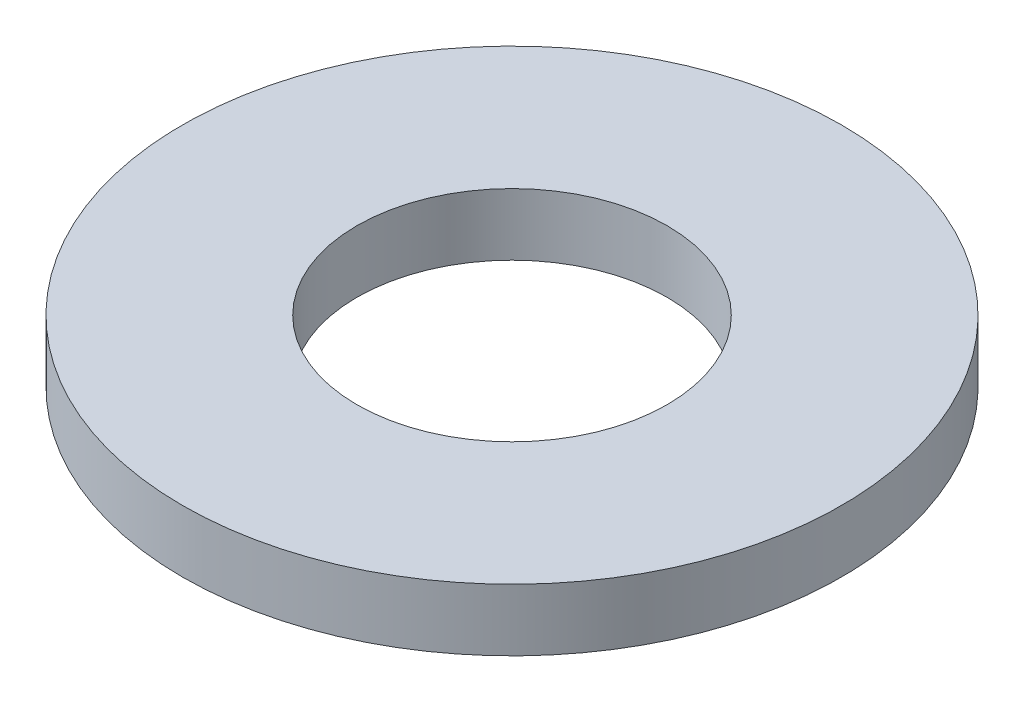
ISO-10303-21;
HEADER;
FILE_DESCRIPTION(('STEP AP214'),'2;1');
FILE_NAME('part.step','',(''),(''),'','','');
FILE_SCHEMA(('AUTOMOTIVE_DESIGN { 1 0 10303 214 1 1 1 1 }'));
ENDSEC;
DATA;
#1=APPLICATION_CONTEXT('core data for automotive mechanical design processes');
#2=APPLICATION_PROTOCOL_DEFINITION('international standard','automotive_design',2000,#1);
#3=PRODUCT_CONTEXT('',#1,'mechanical');
#4=PRODUCT('Part','Part','',(#3));
#5=PRODUCT_RELATED_PRODUCT_CATEGORY('part','',(#4));
#6=PRODUCT_DEFINITION_FORMATION('','',#4);
#7=PRODUCT_DEFINITION_CONTEXT('part definition',#1,'design');
#8=PRODUCT_DEFINITION('design','',#6,#7);
#9=PRODUCT_DEFINITION_SHAPE('','',#8);
#10=(LENGTH_UNIT() NAMED_UNIT(*) SI_UNIT(.MILLI.,.METRE.));
#11=(NAMED_UNIT(*) PLANE_ANGLE_UNIT() SI_UNIT($,.RADIAN.));
#12=(NAMED_UNIT(*) SI_UNIT($,.STERADIAN.) SOLID_ANGLE_UNIT());
#13=UNCERTAINTY_MEASURE_WITH_UNIT(LENGTH_MEASURE(1.E-05),#10,'distance_accuracy_value','');
#14=(GEOMETRIC_REPRESENTATION_CONTEXT(3) GLOBAL_UNCERTAINTY_ASSIGNED_CONTEXT((#13)) GLOBAL_UNIT_ASSIGNED_CONTEXT((#10,
#11,#12)) REPRESENTATION_CONTEXT('',''));
#15=CARTESIAN_POINT('',(0.,0.,0.));
#16=DIRECTION('',(0.,0.,1.));
#17=DIRECTION('',(1.,0.,0.));
#18=AXIS2_PLACEMENT_3D('',#15,#16,#17);
#19=CARTESIAN_POINT('',(0.,0.64,0.));
#20=DIRECTION('',(0.,1.,0.));
#21=DIRECTION('',(0.,0.,1.));
#22=AXIS2_PLACEMENT_3D('',#19,#20,#21);
#23=PLANE('',#22);
#24=CARTESIAN_POINT('',(0.,0.64,0.));
#25=DIRECTION('',(0.,1.,0.));
#26=DIRECTION('',(0.,0.,1.));
#27=AXIS2_PLACEMENT_3D('',#24,#25,#26);
#28=CIRCLE('',#27,3.4);
#29=CARTESIAN_POINT('',(0.,0.64,-3.4));
#30=VERTEX_POINT('',#29);
#31=EDGE_CURVE('E10',#30,#30,#28,.T.);
#32=ORIENTED_EDGE('',*,*,#31,.T.);
#33=EDGE_LOOP('',(#32));
#34=FACE_BOUND('',#33,.T.);
#35=CARTESIAN_POINT('',(0.,0.64,0.));
#36=DIRECTION('',(0.,1.,0.));
#37=DIRECTION('',(0.,0.,1.));
#38=AXIS2_PLACEMENT_3D('',#35,#36,#37);
#39=CIRCLE('',#38,1.6);
#40=CARTESIAN_POINT('',(0.,0.64,-1.6));
#41=VERTEX_POINT('',#40);
#42=EDGE_CURVE('E54',#41,#41,#39,.T.);
#43=ORIENTED_EDGE('',*,*,#42,.F.);
#44=EDGE_LOOP('',(#43));
#45=FACE_BOUND('',#44,.T.);
#46=ADVANCED_FACE('F41',(#34,#45),#23,.T.);
#47=CARTESIAN_POINT('',(0.,0.,0.));
#48=DIRECTION('',(0.,1.,0.));
#49=DIRECTION('',(0.,0.,1.));
#50=AXIS2_PLACEMENT_3D('',#47,#48,#49);
#51=PLANE('',#50);
#52=CARTESIAN_POINT('',(0.,0.,0.));
#53=DIRECTION('',(0.,1.,0.));
#54=DIRECTION('',(0.,0.,1.));
#55=AXIS2_PLACEMENT_3D('',#52,#53,#54);
#56=CIRCLE('',#55,3.4);
#57=CARTESIAN_POINT('',(0.,0.,-3.4));
#58=VERTEX_POINT('',#57);
#59=EDGE_CURVE('E45',#58,#58,#56,.T.);
#60=ORIENTED_EDGE('',*,*,#59,.F.);
#61=EDGE_LOOP('',(#60));
#62=FACE_BOUND('',#61,.T.);
#63=CARTESIAN_POINT('',(0.,0.,0.));
#64=DIRECTION('',(0.,1.,0.));
#65=DIRECTION('',(0.,0.,1.));
#66=AXIS2_PLACEMENT_3D('',#63,#64,#65);
#67=CIRCLE('',#66,1.6);
#68=CARTESIAN_POINT('',(0.,0.,-1.6));
#69=VERTEX_POINT('',#68);
#70=EDGE_CURVE('E56',#69,#69,#67,.T.);
#71=ORIENTED_EDGE('',*,*,#70,.T.);
#72=EDGE_LOOP('',(#71));
#73=FACE_BOUND('',#72,.T.);
#74=ADVANCED_FACE('F68',(#62,#73),#51,.F.);
#75=CARTESIAN_POINT('',(0.,0.64,0.));
#76=DIRECTION('',(0.,-1.,0.));
#77=DIRECTION('',(0.,0.,-1.));
#78=AXIS2_PLACEMENT_3D('',#75,#76,#77);
#79=CYLINDRICAL_SURFACE('',#78,3.4);
#80=CARTESIAN_POINT('',(0.,0.64,-3.4));
#81=CARTESIAN_POINT('',(0.,0.633333333333333,-3.4));
#82=CARTESIAN_POINT('',(0.,0.626666666666667,-3.4));
#83=CARTESIAN_POINT('',(0.,0.613333333333333,-3.4));
#84=CARTESIAN_POINT('',(0.,0.606666666666667,-3.4));
#85=CARTESIAN_POINT('',(0.,0.593333333333333,-3.4));
#86=CARTESIAN_POINT('',(0.,0.586666666666667,-3.4));
#87=CARTESIAN_POINT('',(0.,0.573333333333333,-3.4));
#88=CARTESIAN_POINT('',(0.,0.566666666666667,-3.4));
#89=CARTESIAN_POINT('',(0.,0.553333333333333,-3.4));
#90=CARTESIAN_POINT('',(0.,0.546666666666667,-3.4));
#91=CARTESIAN_POINT('',(0.,0.533333333333333,-3.4));
#92=CARTESIAN_POINT('',(0.,0.526666666666667,-3.4));
#93=CARTESIAN_POINT('',(0.,0.513333333333333,-3.4));
#94=CARTESIAN_POINT('',(0.,0.506666666666667,-3.4));
#95=CARTESIAN_POINT('',(0.,0.493333333333333,-3.4));
#96=CARTESIAN_POINT('',(0.,0.486666666666667,-3.4));
#97=CARTESIAN_POINT('',(0.,0.473333333333333,-3.4));
#98=CARTESIAN_POINT('',(0.,0.466666666666667,-3.4));
#99=CARTESIAN_POINT('',(0.,0.453333333333333,-3.4));
#100=CARTESIAN_POINT('',(0.,0.446666666666667,-3.4));
#101=CARTESIAN_POINT('',(0.,0.433333333333333,-3.4));
#102=CARTESIAN_POINT('',(0.,0.426666666666667,-3.4));
#103=CARTESIAN_POINT('',(0.,0.413333333333333,-3.4));
#104=CARTESIAN_POINT('',(0.,0.406666666666667,-3.4));
#105=CARTESIAN_POINT('',(0.,0.393333333333333,-3.4));
#106=CARTESIAN_POINT('',(0.,0.386666666666667,-3.4));
#107=CARTESIAN_POINT('',(0.,0.373333333333333,-3.4));
#108=CARTESIAN_POINT('',(0.,0.366666666666667,-3.4));
#109=CARTESIAN_POINT('',(0.,0.353333333333333,-3.4));
#110=CARTESIAN_POINT('',(0.,0.346666666666667,-3.4));
#111=CARTESIAN_POINT('',(0.,0.333333333333333,-3.4));
#112=CARTESIAN_POINT('',(0.,0.326666666666667,-3.4));
#113=CARTESIAN_POINT('',(0.,0.313333333333333,-3.4));
#114=CARTESIAN_POINT('',(0.,0.306666666666667,-3.4));
#115=CARTESIAN_POINT('',(0.,0.293333333333333,-3.4));
#116=CARTESIAN_POINT('',(0.,0.286666666666667,-3.4));
#117=CARTESIAN_POINT('',(0.,0.273333333333333,-3.4));
#118=CARTESIAN_POINT('',(0.,0.266666666666667,-3.4));
#119=CARTESIAN_POINT('',(0.,0.253333333333333,-3.4));
#120=CARTESIAN_POINT('',(0.,0.246666666666667,-3.4));
#121=CARTESIAN_POINT('',(0.,0.233333333333333,-3.4));
#122=CARTESIAN_POINT('',(0.,0.226666666666667,-3.4));
#123=CARTESIAN_POINT('',(0.,0.213333333333333,-3.4));
#124=CARTESIAN_POINT('',(0.,0.206666666666667,-3.4));
#125=CARTESIAN_POINT('',(0.,0.193333333333333,-3.4));
#126=CARTESIAN_POINT('',(0.,0.186666666666667,-3.4));
#127=CARTESIAN_POINT('',(0.,0.173333333333333,-3.4));
#128=CARTESIAN_POINT('',(0.,0.166666666666667,-3.4));
#129=CARTESIAN_POINT('',(0.,0.153333333333333,-3.4));
#130=CARTESIAN_POINT('',(0.,0.146666666666667,-3.4));
#131=CARTESIAN_POINT('',(0.,0.133333333333333,-3.4));
#132=CARTESIAN_POINT('',(0.,0.126666666666667,-3.4));
#133=CARTESIAN_POINT('',(0.,0.113333333333333,-3.4));
#134=CARTESIAN_POINT('',(0.,0.106666666666667,-3.4));
#135=CARTESIAN_POINT('',(0.,0.0933333333333334,-3.4));
#136=CARTESIAN_POINT('',(0.,0.0866666666666667,-3.4));
#137=CARTESIAN_POINT('',(0.,0.0733333333333333,-3.4));
#138=CARTESIAN_POINT('',(0.,0.0666666666666667,-3.4));
#139=CARTESIAN_POINT('',(0.,0.0533333333333334,-3.4));
#140=CARTESIAN_POINT('',(0.,0.0466666666666667,-3.4));
#141=CARTESIAN_POINT('',(0.,0.0333333333333333,-3.4));
#142=CARTESIAN_POINT('',(0.,0.0266666666666667,-3.4));
#143=CARTESIAN_POINT('',(0.,0.0133333333333334,-3.4));
#144=CARTESIAN_POINT('',(0.,0.00666666666666668,-3.4));
#145=CARTESIAN_POINT('',(0.,0.,-3.4));
#146=B_SPLINE_CURVE_WITH_KNOTS('',3,(#80,#81,#82,#83,#84,#85,#86,#87,#88,#89,#90,#91,#92,#93,
#94,#95,#96,#97,#98,#99,#100,#101,#102,#103,#104,#105,#106,#107,#108,#109,#110,#111,#112,#113,
#114,#115,#116,#117,#118,#119,#120,#121,#122,#123,#124,#125,#126,#127,#128,#129,#130,#131,#132,
#133,#134,#135,#136,#137,#138,#139,#140,#141,#142,#143,#144,#145),.UNSPECIFIED.,.F.,.F.,(4,2,2,
2,2,2,2,2,2,2,2,2,2,2,2,2,2,2,2,2,2,2,2,2,2,2,2,2,2,2,2,2,4),(0.,0.0200000000000001,
0.0400000000000001,0.06,0.0800000000000001,0.1,0.12,0.14,0.16,0.18,0.2,0.22,0.24,0.26,0.28,0.3,
0.32,0.34,0.36,0.38,0.4,0.42,0.44,0.46,0.48,0.5,0.52,0.54,0.56,0.58,0.6,0.62,0.64),.UNSPECIFIED.);
#147=EDGE_CURVE('BSEAM43',#30,#58,#146,.T.);
#148=ORIENTED_EDGE('',*,*,#31,.F.);
#149=ORIENTED_EDGE('',*,*,#59,.T.);
#150=ORIENTED_EDGE('',*,*,#147,.T.);
#151=ORIENTED_EDGE('',*,*,#147,.F.);
#152=EDGE_LOOP('',(#148,#150,#149,#151));
#153=FACE_BOUND('',#152,.T.);
#154=ADVANCED_FACE('F43',(#153),#79,.T.);
#155=CARTESIAN_POINT('',(0.,0.64,0.));
#156=DIRECTION('',(0.,-1.,0.));
#157=DIRECTION('',(0.,0.,-1.));
#158=AXIS2_PLACEMENT_3D('',#155,#156,#157);
#159=CYLINDRICAL_SURFACE('',#158,1.6);
#160=CARTESIAN_POINT('',(0.,0.64,-1.6));
#161=CARTESIAN_POINT('',(0.,0.633333333333333,-1.6));
#162=CARTESIAN_POINT('',(0.,0.626666666666667,-1.6));
#163=CARTESIAN_POINT('',(0.,0.613333333333333,-1.6));
#164=CARTESIAN_POINT('',(0.,0.606666666666667,-1.6));
#165=CARTESIAN_POINT('',(0.,0.593333333333333,-1.6));
#166=CARTESIAN_POINT('',(0.,0.586666666666667,-1.6));
#167=CARTESIAN_POINT('',(0.,0.573333333333333,-1.6));
#168=CARTESIAN_POINT('',(0.,0.566666666666667,-1.6));
#169=CARTESIAN_POINT('',(0.,0.553333333333333,-1.6));
#170=CARTESIAN_POINT('',(0.,0.546666666666667,-1.6));
#171=CARTESIAN_POINT('',(0.,0.533333333333333,-1.6));
#172=CARTESIAN_POINT('',(0.,0.526666666666667,-1.6));
#173=CARTESIAN_POINT('',(0.,0.513333333333333,-1.6));
#174=CARTESIAN_POINT('',(0.,0.506666666666667,-1.6));
#175=CARTESIAN_POINT('',(0.,0.493333333333333,-1.6));
#176=CARTESIAN_POINT('',(0.,0.486666666666667,-1.6));
#177=CARTESIAN_POINT('',(0.,0.473333333333333,-1.6));
#178=CARTESIAN_POINT('',(0.,0.466666666666667,-1.6));
#179=CARTESIAN_POINT('',(0.,0.453333333333333,-1.6));
#180=CARTESIAN_POINT('',(0.,0.446666666666667,-1.6));
#181=CARTESIAN_POINT('',(0.,0.433333333333333,-1.6));
#182=CARTESIAN_POINT('',(0.,0.426666666666667,-1.6));
#183=CARTESIAN_POINT('',(0.,0.413333333333333,-1.6));
#184=CARTESIAN_POINT('',(0.,0.406666666666667,-1.6));
#185=CARTESIAN_POINT('',(0.,0.393333333333333,-1.6));
#186=CARTESIAN_POINT('',(0.,0.386666666666667,-1.6));
#187=CARTESIAN_POINT('',(0.,0.373333333333333,-1.6));
#188=CARTESIAN_POINT('',(0.,0.366666666666667,-1.6));
#189=CARTESIAN_POINT('',(0.,0.353333333333333,-1.6));
#190=CARTESIAN_POINT('',(0.,0.346666666666667,-1.6));
#191=CARTESIAN_POINT('',(0.,0.333333333333333,-1.6));
#192=CARTESIAN_POINT('',(0.,0.326666666666667,-1.6));
#193=CARTESIAN_POINT('',(0.,0.313333333333333,-1.6));
#194=CARTESIAN_POINT('',(0.,0.306666666666667,-1.6));
#195=CARTESIAN_POINT('',(0.,0.293333333333333,-1.6));
#196=CARTESIAN_POINT('',(0.,0.286666666666667,-1.6));
#197=CARTESIAN_POINT('',(0.,0.273333333333333,-1.6));
#198=CARTESIAN_POINT('',(0.,0.266666666666667,-1.6));
#199=CARTESIAN_POINT('',(0.,0.253333333333333,-1.6));
#200=CARTESIAN_POINT('',(0.,0.246666666666667,-1.6));
#201=CARTESIAN_POINT('',(0.,0.233333333333333,-1.6));
#202=CARTESIAN_POINT('',(0.,0.226666666666667,-1.6));
#203=CARTESIAN_POINT('',(0.,0.213333333333333,-1.6));
#204=CARTESIAN_POINT('',(0.,0.206666666666667,-1.6));
#205=CARTESIAN_POINT('',(0.,0.193333333333333,-1.6));
#206=CARTESIAN_POINT('',(0.,0.186666666666667,-1.6));
#207=CARTESIAN_POINT('',(0.,0.173333333333333,-1.6));
#208=CARTESIAN_POINT('',(0.,0.166666666666667,-1.6));
#209=CARTESIAN_POINT('',(0.,0.153333333333333,-1.6));
#210=CARTESIAN_POINT('',(0.,0.146666666666667,-1.6));
#211=CARTESIAN_POINT('',(0.,0.133333333333333,-1.6));
#212=CARTESIAN_POINT('',(0.,0.126666666666667,-1.6));
#213=CARTESIAN_POINT('',(0.,0.113333333333333,-1.6));
#214=CARTESIAN_POINT('',(0.,0.106666666666667,-1.6));
#215=CARTESIAN_POINT('',(0.,0.0933333333333334,-1.6));
#216=CARTESIAN_POINT('',(0.,0.0866666666666667,-1.6));
#217=CARTESIAN_POINT('',(0.,0.0733333333333333,-1.6));
#218=CARTESIAN_POINT('',(0.,0.0666666666666667,-1.6));
#219=CARTESIAN_POINT('',(0.,0.0533333333333334,-1.6));
#220=CARTESIAN_POINT('',(0.,0.0466666666666667,-1.6));
#221=CARTESIAN_POINT('',(0.,0.0333333333333333,-1.6));
#222=CARTESIAN_POINT('',(0.,0.0266666666666667,-1.6));
#223=CARTESIAN_POINT('',(0.,0.0133333333333334,-1.6));
#224=CARTESIAN_POINT('',(0.,0.00666666666666668,-1.6));
#225=CARTESIAN_POINT('',(0.,0.,-1.6));
#226=B_SPLINE_CURVE_WITH_KNOTS('',3,(#160,#161,#162,#163,#164,#165,#166,#167,#168,#169,#170,
#171,#172,#173,#174,#175,#176,#177,#178,#179,#180,#181,#182,#183,#184,#185,#186,#187,#188,#189,
#190,#191,#192,#193,#194,#195,#196,#197,#198,#199,#200,#201,#202,#203,#204,#205,#206,#207,#208,
#209,#210,#211,#212,#213,#214,#215,#216,#217,#218,#219,#220,#221,#222,#223,#224,#225),
.UNSPECIFIED.,.F.,.F.,(4,2,2,2,2,2,2,2,2,2,2,2,2,2,2,2,2,2,2,2,2,2,2,2,2,2,2,2,2,2,2,2,4),(0.,
0.0200000000000001,0.0400000000000001,0.06,0.0800000000000001,0.1,0.12,0.14,0.16,0.18,0.2,0.22,
0.24,0.26,0.28,0.3,0.32,0.34,0.36,0.38,0.4,0.42,0.44,0.46,0.48,0.5,0.52,0.54,0.56,0.58,0.6,0.62,
0.64),.UNSPECIFIED.);
#227=EDGE_CURVE('BSEAM64',#41,#69,#226,.T.);
#228=ORIENTED_EDGE('',*,*,#42,.T.);
#229=ORIENTED_EDGE('',*,*,#70,.F.);
#230=ORIENTED_EDGE('',*,*,#227,.T.);
#231=ORIENTED_EDGE('',*,*,#227,.F.);
#232=EDGE_LOOP('',(#228,#230,#229,#231));
#233=FACE_BOUND('',#232,.T.);
#234=ADVANCED_FACE('F64',(#233),#159,.F.);
#235=CLOSED_SHELL('',(#46,#74,#154,#234));
#236=MANIFOLD_SOLID_BREP('B2',#235);
#237=ADVANCED_BREP_SHAPE_REPRESENTATION('',(#18,#236),#14);
#238=SHAPE_DEFINITION_REPRESENTATION(#9,#237);
ENDSEC;
END-ISO-10303-21;
